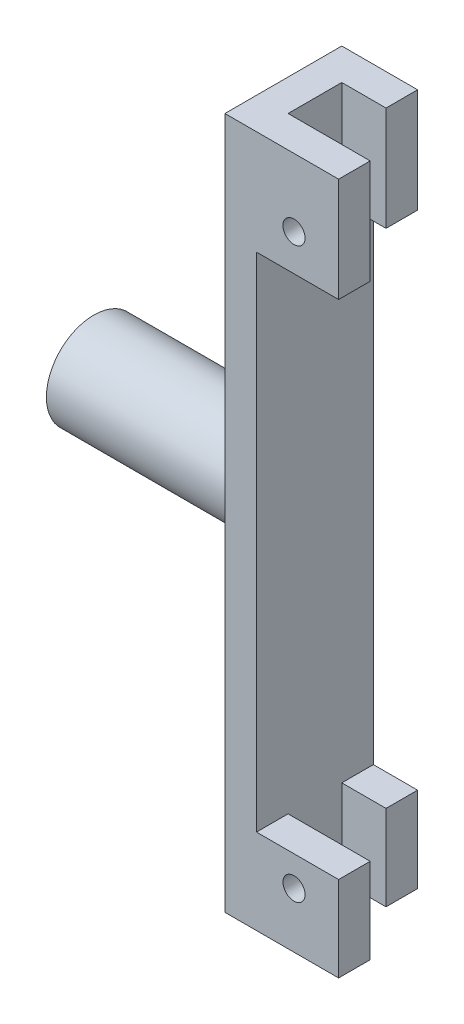
ISO-10303-21;
HEADER;
FILE_DESCRIPTION(('STEP AP214'),'2;1');
FILE_NAME('part.step','',(''),(''),'','','');
FILE_SCHEMA(('AUTOMOTIVE_DESIGN { 1 0 10303 214 1 1 1 1 }'));
ENDSEC;
DATA;
#1=APPLICATION_CONTEXT('core data for automotive mechanical design processes');
#2=APPLICATION_PROTOCOL_DEFINITION('international standard','automotive_design',2000,#1);
#3=PRODUCT_CONTEXT('',#1,'mechanical');
#4=PRODUCT('Part','Part','',(#3));
#5=PRODUCT_RELATED_PRODUCT_CATEGORY('part','',(#4));
#6=PRODUCT_DEFINITION_FORMATION('','',#4);
#7=PRODUCT_DEFINITION_CONTEXT('part definition',#1,'design');
#8=PRODUCT_DEFINITION('design','',#6,#7);
#9=PRODUCT_DEFINITION_SHAPE('','',#8);
#10=(LENGTH_UNIT() NAMED_UNIT(*) SI_UNIT(.MILLI.,.METRE.));
#11=(NAMED_UNIT(*) PLANE_ANGLE_UNIT() SI_UNIT($,.RADIAN.));
#12=(NAMED_UNIT(*) SI_UNIT($,.STERADIAN.) SOLID_ANGLE_UNIT());
#13=UNCERTAINTY_MEASURE_WITH_UNIT(LENGTH_MEASURE(1.E-05),#10,'distance_accuracy_value','');
#14=(GEOMETRIC_REPRESENTATION_CONTEXT(3) GLOBAL_UNCERTAINTY_ASSIGNED_CONTEXT((#13)) GLOBAL_UNIT_ASSIGNED_CONTEXT((#10,
#11,#12)) REPRESENTATION_CONTEXT('',''));
#15=CARTESIAN_POINT('',(0.,0.,0.));
#16=DIRECTION('',(0.,0.,1.));
#17=DIRECTION('',(1.,0.,0.));
#18=AXIS2_PLACEMENT_3D('',#15,#16,#17);
#19=CARTESIAN_POINT('',(-18.,-109.5,37.));
#20=DIRECTION('',(1.,0.,0.));
#21=DIRECTION('',(0.,0.,-1.));
#22=AXIS2_PLACEMENT_3D('',#19,#20,#21);
#23=PLANE('',#22);
#24=DIRECTION('',(0.,-1.,0.));
#25=VECTOR('',#24,1.);
#26=CARTESIAN_POINT('',(-18.,-109.5,0.));
#27=LINE('',#26,#25);
#28=CARTESIAN_POINT('',(-18.,109.5,0.));
#29=VERTEX_POINT('',#28);
#30=CARTESIAN_POINT('',(-18.,-109.5,0.));
#31=VERTEX_POINT('',#30);
#32=EDGE_CURVE('E170',#29,#31,#27,.T.);
#33=ORIENTED_EDGE('',*,*,#32,.T.);
#34=DIRECTION('',(0.,0.,-1.));
#35=VECTOR('',#34,1.);
#36=CARTESIAN_POINT('',(-18.,-109.5,37.));
#37=LINE('',#36,#35);
#38=CARTESIAN_POINT('',(-18.,-109.5,37.));
#39=VERTEX_POINT('',#38);
#40=EDGE_CURVE('E167',#39,#31,#37,.T.);
#41=ORIENTED_EDGE('',*,*,#40,.F.);
#42=DIRECTION('',(0.,-1.,0.));
#43=VECTOR('',#42,1.);
#44=CARTESIAN_POINT('',(-18.,-109.5,37.));
#45=LINE('',#44,#43);
#46=CARTESIAN_POINT('',(-18.,109.5,37.));
#47=VERTEX_POINT('',#46);
#48=EDGE_CURVE('E172',#47,#39,#45,.T.);
#49=ORIENTED_EDGE('',*,*,#48,.F.);
#50=DIRECTION('',(0.,0.,-1.));
#51=VECTOR('',#50,1.);
#52=CARTESIAN_POINT('',(-18.,109.5,37.));
#53=LINE('',#52,#51);
#54=EDGE_CURVE('E178',#47,#29,#53,.T.);
#55=ORIENTED_EDGE('',*,*,#54,.T.);
#56=EDGE_LOOP('',(#33,#41,#49,#55));
#57=FACE_BOUND('',#56,.T.);
#58=CARTESIAN_POINT('',(-18.,0.,18.5));
#59=DIRECTION('',(1.,0.,0.));
#60=DIRECTION('',(0.,0.,-1.));
#61=AXIS2_PLACEMENT_3D('',#58,#59,#60);
#62=CIRCLE('',#61,15.);
#63=CARTESIAN_POINT('',(-18.,0.,3.49999999999996));
#64=VERTEX_POINT('',#63);
#65=EDGE_CURVE('E11',#64,#64,#62,.F.);
#66=ORIENTED_EDGE('',*,*,#65,.F.);
#67=EDGE_LOOP('',(#66));
#68=FACE_BOUND('',#67,.T.);
#69=ADVANCED_FACE('F34',(#57,#68),#23,.F.);
#70=CARTESIAN_POINT('',(-7.99999999999997,-82.5,37.));
#71=DIRECTION('',(0.,1.,0.));
#72=DIRECTION('',(0.,0.,1.));
#73=AXIS2_PLACEMENT_3D('',#70,#71,#72);
#74=PLANE('',#73);
#75=DIRECTION('',(1.,0.,0.));
#76=VECTOR('',#75,1.);
#77=CARTESIAN_POINT('',(-7.99999999999997,-82.5,10.));
#78=LINE('',#77,#76);
#79=CARTESIAN_POINT('',(-7.99999999999997,-82.5,10.));
#80=VERTEX_POINT('',#79);
#81=CARTESIAN_POINT('',(6.00000000000003,-82.5,10.));
#82=VERTEX_POINT('',#81);
#83=EDGE_CURVE('E249',#80,#82,#78,.T.);
#84=ORIENTED_EDGE('',*,*,#83,.T.);
#85=DIRECTION('',(0.,0.,-1.));
#86=VECTOR('',#85,1.);
#87=CARTESIAN_POINT('',(6.00000000000003,-82.5,37.));
#88=LINE('',#87,#86);
#89=CARTESIAN_POINT('',(6.00000000000003,-82.5,0.));
#90=VERTEX_POINT('',#89);
#91=EDGE_CURVE('E56',#82,#90,#88,.T.);
#92=ORIENTED_EDGE('',*,*,#91,.T.);
#93=DIRECTION('',(1.,0.,0.));
#94=VECTOR('',#93,1.);
#95=CARTESIAN_POINT('',(-7.99999999999997,-82.5,0.));
#96=LINE('',#95,#94);
#97=CARTESIAN_POINT('',(-7.99999999999997,-82.5,0.));
#98=VERTEX_POINT('',#97);
#99=EDGE_CURVE('E162',#98,#90,#96,.T.);
#100=ORIENTED_EDGE('',*,*,#99,.F.);
#101=DIRECTION('',(0.,0.,-1.));
#102=VECTOR('',#101,1.);
#103=CARTESIAN_POINT('',(-7.99999999999997,-82.5,37.));
#104=LINE('',#103,#102);
#105=EDGE_CURVE('E269',#80,#98,#104,.T.);
#106=ORIENTED_EDGE('',*,*,#105,.F.);
#107=EDGE_LOOP('',(#84,#92,#100,#106));
#108=FACE_BOUND('',#107,.T.);
#109=ADVANCED_FACE('F310',(#108),#74,.T.);
#110=CARTESIAN_POINT('',(-7.99999999999999,76.5,37.));
#111=DIRECTION('',(0.,-1.,0.));
#112=DIRECTION('',(0.,0.,-1.));
#113=AXIS2_PLACEMENT_3D('',#110,#111,#112);
#114=PLANE('',#113);
#115=DIRECTION('',(1.,0.,0.));
#116=VECTOR('',#115,1.);
#117=CARTESIAN_POINT('',(0.,76.5,0.));
#118=LINE('',#117,#116);
#119=CARTESIAN_POINT('',(-7.99999999999999,76.5,0.));
#120=VERTEX_POINT('',#119);
#121=CARTESIAN_POINT('',(6.00000000000001,76.5,0.));
#122=VERTEX_POINT('',#121);
#123=EDGE_CURVE('E189',#120,#122,#118,.T.);
#124=ORIENTED_EDGE('',*,*,#123,.T.);
#125=DIRECTION('',(0.,0.,1.));
#126=VECTOR('',#125,1.);
#127=CARTESIAN_POINT('',(6.00000000000001,76.5,37.));
#128=LINE('',#127,#126);
#129=CARTESIAN_POINT('',(6.00000000000001,76.5,10.));
#130=VERTEX_POINT('',#129);
#131=EDGE_CURVE('E216',#122,#130,#128,.T.);
#132=ORIENTED_EDGE('',*,*,#131,.T.);
#133=DIRECTION('',(-1.,0.,0.));
#134=VECTOR('',#133,1.);
#135=CARTESIAN_POINT('',(-7.99999999999999,76.5,10.));
#136=LINE('',#135,#134);
#137=CARTESIAN_POINT('',(-7.99999999999999,76.5,10.));
#138=VERTEX_POINT('',#137);
#139=EDGE_CURVE('E247',#130,#138,#136,.T.);
#140=ORIENTED_EDGE('',*,*,#139,.T.);
#141=DIRECTION('',(0.,0.,-1.));
#142=VECTOR('',#141,1.);
#143=CARTESIAN_POINT('',(-7.99999999999999,76.5,37.));
#144=LINE('',#143,#142);
#145=EDGE_CURVE('E263',#138,#120,#144,.T.);
#146=ORIENTED_EDGE('',*,*,#145,.T.);
#147=EDGE_LOOP('',(#124,#132,#140,#146));
#148=FACE_BOUND('',#147,.T.);
#149=ADVANCED_FACE('F300',(#148),#114,.T.);
#150=CARTESIAN_POINT('',(0.,0.,0.));
#151=DIRECTION('',(0.,0.,1.));
#152=DIRECTION('',(1.,0.,0.));
#153=AXIS2_PLACEMENT_3D('',#150,#151,#152);
#154=PLANE('',#153);
#155=DIRECTION('',(0.,-1.,0.));
#156=VECTOR('',#155,1.);
#157=CARTESIAN_POINT('',(6.,126.5,0.));
#158=LINE('',#157,#156);
#159=CARTESIAN_POINT('',(6.00000000000003,-109.5,0.));
#160=VERTEX_POINT('',#159);
#161=EDGE_CURVE('E147',#90,#160,#158,.T.);
#162=ORIENTED_EDGE('',*,*,#161,.T.);
#163=DIRECTION('',(1.,0.,0.));
#164=VECTOR('',#163,1.);
#165=CARTESIAN_POINT('',(18.,-109.5,0.));
#166=LINE('',#165,#164);
#167=EDGE_CURVE('E158',#31,#160,#166,.T.);
#168=ORIENTED_EDGE('',*,*,#167,.F.);
#169=ORIENTED_EDGE('',*,*,#32,.F.);
#170=DIRECTION('',(-1.,0.,0.));
#171=VECTOR('',#170,1.);
#172=CARTESIAN_POINT('',(18.,109.5,0.));
#173=LINE('',#172,#171);
#174=CARTESIAN_POINT('',(6.,109.5,0.));
#175=VERTEX_POINT('',#174);
#176=EDGE_CURVE('E169',#175,#29,#173,.T.);
#177=ORIENTED_EDGE('',*,*,#176,.F.);
#178=EDGE_CURVE('E152',#175,#122,#158,.T.);
#179=ORIENTED_EDGE('',*,*,#178,.T.);
#180=ORIENTED_EDGE('',*,*,#123,.F.);
#181=DIRECTION('',(0.,-1.,0.));
#182=VECTOR('',#181,1.);
#183=CARTESIAN_POINT('',(-7.99999999999999,76.5,0.));
#184=LINE('',#183,#182);
#185=EDGE_CURVE('E256',#120,#98,#184,.T.);
#186=ORIENTED_EDGE('',*,*,#185,.T.);
#187=ORIENTED_EDGE('',*,*,#99,.T.);
#188=EDGE_LOOP('',(#162,#168,#169,#177,#179,#180,#186,#187));
#189=FACE_BOUND('',#188,.T.);
#190=ADVANCED_FACE('F156',(#189),#154,.F.);
#191=CARTESIAN_POINT('',(18.,-109.5,37.));
#192=DIRECTION('',(0.,1.,0.));
#193=DIRECTION('',(0.,0.,1.));
#194=AXIS2_PLACEMENT_3D('',#191,#192,#193);
#195=PLANE('',#194);
#196=DIRECTION('',(0.,0.,-1.));
#197=VECTOR('',#196,1.);
#198=CARTESIAN_POINT('',(6.00000000000003,-109.5,17.));
#199=LINE('',#198,#197);
#200=CARTESIAN_POINT('',(6.00000000000003,-109.5,10.));
#201=VERTEX_POINT('',#200);
#202=EDGE_CURVE('E144',#201,#160,#199,.T.);
#203=ORIENTED_EDGE('',*,*,#202,.F.);
#204=DIRECTION('',(1.,0.,0.));
#205=VECTOR('',#204,1.);
#206=CARTESIAN_POINT('',(-7.99999999999997,-109.5,10.));
#207=LINE('',#206,#205);
#208=CARTESIAN_POINT('',(-7.99999999999997,-109.5,10.));
#209=VERTEX_POINT('',#208);
#210=EDGE_CURVE('E238',#209,#201,#207,.T.);
#211=ORIENTED_EDGE('',*,*,#210,.F.);
#212=DIRECTION('',(0.,0.,-1.));
#213=VECTOR('',#212,1.);
#214=CARTESIAN_POINT('',(-7.99999999999997,-109.5,27.));
#215=LINE('',#214,#213);
#216=CARTESIAN_POINT('',(-7.99999999999997,-109.5,27.));
#217=VERTEX_POINT('',#216);
#218=EDGE_CURVE('E244',#217,#209,#215,.T.);
#219=ORIENTED_EDGE('',*,*,#218,.F.);
#220=DIRECTION('',(1.,0.,0.));
#221=VECTOR('',#220,1.);
#222=CARTESIAN_POINT('',(-7.99999999999997,-109.5,27.));
#223=LINE('',#222,#221);
#224=CARTESIAN_POINT('',(18.,-109.5,27.));
#225=VERTEX_POINT('',#224);
#226=EDGE_CURVE('E223',#217,#225,#223,.T.);
#227=ORIENTED_EDGE('',*,*,#226,.T.);
#228=DIRECTION('',(0.,0.,-1.));
#229=VECTOR('',#228,1.);
#230=CARTESIAN_POINT('',(18.,-109.5,37.));
#231=LINE('',#230,#229);
#232=CARTESIAN_POINT('',(18.,-109.5,37.));
#233=VERTEX_POINT('',#232);
#234=EDGE_CURVE('E185',#233,#225,#231,.T.);
#235=ORIENTED_EDGE('',*,*,#234,.F.);
#236=DIRECTION('',(1.,0.,0.));
#237=VECTOR('',#236,1.);
#238=CARTESIAN_POINT('',(18.,-109.5,37.));
#239=LINE('',#238,#237);
#240=EDGE_CURVE('E279',#39,#233,#239,.T.);
#241=ORIENTED_EDGE('',*,*,#240,.F.);
#242=ORIENTED_EDGE('',*,*,#40,.T.);
#243=ORIENTED_EDGE('',*,*,#167,.T.);
#244=EDGE_LOOP('',(#203,#211,#219,#227,#235,#241,#242,#243));
#245=FACE_BOUND('',#244,.T.);
#246=ADVANCED_FACE('F165',(#245),#195,.F.);
#247=CARTESIAN_POINT('',(18.,109.5,37.));
#248=DIRECTION('',(0.,-1.,0.));
#249=DIRECTION('',(0.,0.,-1.));
#250=AXIS2_PLACEMENT_3D('',#247,#248,#249);
#251=PLANE('',#250);
#252=DIRECTION('',(0.,0.,1.));
#253=VECTOR('',#252,1.);
#254=CARTESIAN_POINT('',(6.,109.5,37.));
#255=LINE('',#254,#253);
#256=CARTESIAN_POINT('',(6.,109.5,10.));
#257=VERTEX_POINT('',#256);
#258=EDGE_CURVE('E48',#175,#257,#255,.T.);
#259=ORIENTED_EDGE('',*,*,#258,.F.);
#260=ORIENTED_EDGE('',*,*,#176,.T.);
#261=ORIENTED_EDGE('',*,*,#54,.F.);
#262=DIRECTION('',(-1.,0.,0.));
#263=VECTOR('',#262,1.);
#264=CARTESIAN_POINT('',(18.,109.5,37.));
#265=LINE('',#264,#263);
#266=CARTESIAN_POINT('',(18.,109.5,37.));
#267=VERTEX_POINT('',#266);
#268=EDGE_CURVE('E182',#267,#47,#265,.T.);
#269=ORIENTED_EDGE('',*,*,#268,.F.);
#270=DIRECTION('',(0.,0.,-1.));
#271=VECTOR('',#270,1.);
#272=CARTESIAN_POINT('',(18.,109.5,37.));
#273=LINE('',#272,#271);
#274=CARTESIAN_POINT('',(18.,109.5,27.));
#275=VERTEX_POINT('',#274);
#276=EDGE_CURVE('E181',#267,#275,#273,.T.);
#277=ORIENTED_EDGE('',*,*,#276,.T.);
#278=DIRECTION('',(-1.,0.,0.));
#279=VECTOR('',#278,1.);
#280=CARTESIAN_POINT('',(-8.,109.5,27.));
#281=LINE('',#280,#279);
#282=CARTESIAN_POINT('',(-8.,109.5,27.));
#283=VERTEX_POINT('',#282);
#284=EDGE_CURVE('E231',#275,#283,#281,.T.);
#285=ORIENTED_EDGE('',*,*,#284,.T.);
#286=DIRECTION('',(0.,0.,-1.));
#287=VECTOR('',#286,1.);
#288=CARTESIAN_POINT('',(-8.,109.5,27.));
#289=LINE('',#288,#287);
#290=CARTESIAN_POINT('',(-8.,109.5,10.));
#291=VERTEX_POINT('',#290);
#292=EDGE_CURVE('E234',#283,#291,#289,.T.);
#293=ORIENTED_EDGE('',*,*,#292,.T.);
#294=DIRECTION('',(-1.,0.,0.));
#295=VECTOR('',#294,1.);
#296=CARTESIAN_POINT('',(-8.,109.5,10.));
#297=LINE('',#296,#295);
#298=EDGE_CURVE('E240',#257,#291,#297,.T.);
#299=ORIENTED_EDGE('',*,*,#298,.F.);
#300=EDGE_LOOP('',(#259,#260,#261,#269,#277,#285,#293,#299));
#301=FACE_BOUND('',#300,.T.);
#302=ADVANCED_FACE('F293',(#301),#251,.F.);
#303=CARTESIAN_POINT('',(0.,0.,10.));
#304=DIRECTION('',(0.,0.,1.));
#305=DIRECTION('',(1.,0.,0.));
#306=AXIS2_PLACEMENT_3D('',#303,#304,#305);
#307=PLANE('',#306);
#308=ORIENTED_EDGE('',*,*,#139,.F.);
#309=DIRECTION('',(0.,1.,0.));
#310=VECTOR('',#309,1.);
#311=CARTESIAN_POINT('',(6.00000000000002,0.,10.));
#312=LINE('',#311,#310);
#313=EDGE_CURVE('E213',#130,#257,#312,.T.);
#314=ORIENTED_EDGE('',*,*,#313,.T.);
#315=ORIENTED_EDGE('',*,*,#298,.T.);
#316=DIRECTION('',(0.,-1.,0.));
#317=VECTOR('',#316,1.);
#318=CARTESIAN_POINT('',(-8.,109.5,10.));
#319=LINE('',#318,#317);
#320=EDGE_CURVE('E235',#291,#138,#319,.T.);
#321=ORIENTED_EDGE('',*,*,#320,.T.);
#322=EDGE_LOOP('',(#308,#314,#315,#321));
#323=FACE_BOUND('',#322,.T.);
#324=ADVANCED_FACE('F375',(#323),#307,.T.);
#325=ORIENTED_EDGE('',*,*,#210,.T.);
#326=DIRECTION('',(0.,1.,0.));
#327=VECTOR('',#326,1.);
#328=CARTESIAN_POINT('',(6.00000000000002,0.,10.));
#329=LINE('',#328,#327);
#330=EDGE_CURVE('E41',#201,#82,#329,.T.);
#331=ORIENTED_EDGE('',*,*,#330,.T.);
#332=ORIENTED_EDGE('',*,*,#83,.F.);
#333=EDGE_CURVE('E219',#80,#209,#319,.T.);
#334=ORIENTED_EDGE('',*,*,#333,.T.);
#335=EDGE_LOOP('',(#325,#331,#332,#334));
#336=FACE_BOUND('',#335,.T.);
#337=ADVANCED_FACE('F312',(#336),#307,.T.);
#338=CARTESIAN_POINT('',(18.,-109.5,37.));
#339=DIRECTION('',(-1.,0.,0.));
#340=DIRECTION('',(0.,0.,1.));
#341=AXIS2_PLACEMENT_3D('',#338,#339,#340);
#342=PLANE('',#341);
#343=ORIENTED_EDGE('',*,*,#234,.T.);
#344=DIRECTION('',(0.,1.,0.));
#345=VECTOR('',#344,1.);
#346=CARTESIAN_POINT('',(18.,109.5,27.));
#347=LINE('',#346,#345);
#348=CARTESIAN_POINT('',(18.,-82.5,27.));
#349=VERTEX_POINT('',#348);
#350=EDGE_CURVE('E228',#225,#349,#347,.T.);
#351=ORIENTED_EDGE('',*,*,#350,.T.);
#352=DIRECTION('',(0.,0.,-1.));
#353=VECTOR('',#352,1.);
#354=CARTESIAN_POINT('',(18.,-82.5,37.));
#355=LINE('',#354,#353);
#356=CARTESIAN_POINT('',(18.,-82.5,37.));
#357=VERTEX_POINT('',#356);
#358=EDGE_CURVE('E174',#357,#349,#355,.T.);
#359=ORIENTED_EDGE('',*,*,#358,.F.);
#360=DIRECTION('',(0.,1.,0.));
#361=VECTOR('',#360,1.);
#362=CARTESIAN_POINT('',(18.,-109.5,37.));
#363=LINE('',#362,#361);
#364=EDGE_CURVE('E282',#233,#357,#363,.T.);
#365=ORIENTED_EDGE('',*,*,#364,.F.);
#366=EDGE_LOOP('',(#343,#351,#359,#365));
#367=FACE_BOUND('',#366,.T.);
#368=ADVANCED_FACE('F322',(#367),#342,.F.);
#369=DIRECTION('',(0.,0.,1.));
#370=VECTOR('',#369,1.);
#371=CARTESIAN_POINT('',(18.,76.5,37.));
#372=LINE('',#371,#370);
#373=CARTESIAN_POINT('',(18.,76.5,27.));
#374=VERTEX_POINT('',#373);
#375=CARTESIAN_POINT('',(18.,76.5,37.));
#376=VERTEX_POINT('',#375);
#377=EDGE_CURVE('E273',#374,#376,#372,.T.);
#378=ORIENTED_EDGE('',*,*,#377,.F.);
#379=EDGE_CURVE('E227',#374,#275,#347,.T.);
#380=ORIENTED_EDGE('',*,*,#379,.T.);
#381=ORIENTED_EDGE('',*,*,#276,.F.);
#382=EDGE_CURVE('E281',#376,#267,#363,.T.);
#383=ORIENTED_EDGE('',*,*,#382,.F.);
#384=EDGE_LOOP('',(#378,#380,#381,#383));
#385=FACE_BOUND('',#384,.T.);
#386=ADVANCED_FACE('F336',(#385),#342,.F.);
#387=CARTESIAN_POINT('',(0.,0.,37.));
#388=DIRECTION('',(0.,0.,1.));
#389=DIRECTION('',(1.,0.,0.));
#390=AXIS2_PLACEMENT_3D('',#387,#388,#389);
#391=PLANE('',#390);
#392=CARTESIAN_POINT('',(3.87816962595056,-92.,37.));
#393=DIRECTION('',(0.,0.,1.));
#394=DIRECTION('',(1.,0.,0.));
#395=AXIS2_PLACEMENT_3D('',#392,#393,#394);
#396=CIRCLE('',#395,3.5);
#397=CARTESIAN_POINT('',(7.37816962595056,-92.,37.));
#398=VERTEX_POINT('',#397);
#399=EDGE_CURVE('E197',#398,#398,#396,.T.);
#400=ORIENTED_EDGE('',*,*,#399,.F.);
#401=EDGE_LOOP('',(#400));
#402=FACE_BOUND('',#401,.T.);
#403=CARTESIAN_POINT('',(3.87816962595056,88.,37.));
#404=DIRECTION('',(0.,0.,1.));
#405=DIRECTION('',(1.,0.,0.));
#406=AXIS2_PLACEMENT_3D('',#403,#404,#405);
#407=CIRCLE('',#406,3.5);
#408=CARTESIAN_POINT('',(7.37816962595056,88.,37.));
#409=VERTEX_POINT('',#408);
#410=EDGE_CURVE('E194',#409,#409,#407,.T.);
#411=ORIENTED_EDGE('',*,*,#410,.F.);
#412=EDGE_LOOP('',(#411));
#413=FACE_BOUND('',#412,.T.);
#414=ORIENTED_EDGE('',*,*,#364,.T.);
#415=DIRECTION('',(1.,0.,0.));
#416=VECTOR('',#415,1.);
#417=CARTESIAN_POINT('',(-7.99999999999997,-82.5,37.));
#418=LINE('',#417,#416);
#419=CARTESIAN_POINT('',(-7.99999999999997,-82.5,37.));
#420=VERTEX_POINT('',#419);
#421=EDGE_CURVE('E259',#420,#357,#418,.T.);
#422=ORIENTED_EDGE('',*,*,#421,.F.);
#423=DIRECTION('',(0.,-1.,0.));
#424=VECTOR('',#423,1.);
#425=CARTESIAN_POINT('',(-7.99999999999999,76.5,37.));
#426=LINE('',#425,#424);
#427=CARTESIAN_POINT('',(-7.99999999999999,76.5,37.));
#428=VERTEX_POINT('',#427);
#429=EDGE_CURVE('E257',#428,#420,#426,.T.);
#430=ORIENTED_EDGE('',*,*,#429,.F.);
#431=DIRECTION('',(-1.,0.,0.));
#432=VECTOR('',#431,1.);
#433=CARTESIAN_POINT('',(-7.99999999999999,76.5,37.));
#434=LINE('',#433,#432);
#435=EDGE_CURVE('E261',#376,#428,#434,.T.);
#436=ORIENTED_EDGE('',*,*,#435,.F.);
#437=ORIENTED_EDGE('',*,*,#382,.T.);
#438=ORIENTED_EDGE('',*,*,#268,.T.);
#439=ORIENTED_EDGE('',*,*,#48,.T.);
#440=ORIENTED_EDGE('',*,*,#240,.T.);
#441=EDGE_LOOP('',(#414,#422,#430,#436,#437,#438,#439,#440));
#442=FACE_BOUND('',#441,.T.);
#443=ADVANCED_FACE('F287',(#402,#413,#442),#391,.T.);
#444=DIRECTION('',(1.,0.,0.));
#445=VECTOR('',#444,1.);
#446=CARTESIAN_POINT('',(-7.99999999999997,-82.5,27.));
#447=LINE('',#446,#445);
#448=CARTESIAN_POINT('',(-7.99999999999997,-82.5,27.));
#449=VERTEX_POINT('',#448);
#450=EDGE_CURVE('E254',#449,#349,#447,.T.);
#451=ORIENTED_EDGE('',*,*,#450,.F.);
#452=EDGE_CURVE('E270',#420,#449,#104,.T.);
#453=ORIENTED_EDGE('',*,*,#452,.F.);
#454=ORIENTED_EDGE('',*,*,#421,.T.);
#455=ORIENTED_EDGE('',*,*,#358,.T.);
#456=EDGE_LOOP('',(#451,#453,#454,#455));
#457=FACE_BOUND('',#456,.T.);
#458=ADVANCED_FACE('F325',(#457),#74,.T.);
#459=DIRECTION('',(-1.,0.,0.));
#460=VECTOR('',#459,1.);
#461=CARTESIAN_POINT('',(-7.99999999999999,76.5,27.));
#462=LINE('',#461,#460);
#463=CARTESIAN_POINT('',(-7.99999999999999,76.5,27.));
#464=VERTEX_POINT('',#463);
#465=EDGE_CURVE('E252',#374,#464,#462,.T.);
#466=ORIENTED_EDGE('',*,*,#465,.F.);
#467=ORIENTED_EDGE('',*,*,#377,.T.);
#468=ORIENTED_EDGE('',*,*,#435,.T.);
#469=EDGE_CURVE('E266',#428,#464,#144,.T.);
#470=ORIENTED_EDGE('',*,*,#469,.T.);
#471=EDGE_LOOP('',(#466,#467,#468,#470));
#472=FACE_BOUND('',#471,.T.);
#473=ADVANCED_FACE('F332',(#472),#114,.T.);
#474=CARTESIAN_POINT('',(-7.99999999999999,76.5,37.));
#475=DIRECTION('',(1.,0.,0.));
#476=DIRECTION('',(0.,1.,0.));
#477=AXIS2_PLACEMENT_3D('',#474,#475,#476);
#478=PLANE('',#477);
#479=ORIENTED_EDGE('',*,*,#452,.T.);
#480=DIRECTION('',(0.,-1.,0.));
#481=VECTOR('',#480,1.);
#482=CARTESIAN_POINT('',(-8.,109.5,27.));
#483=LINE('',#482,#481);
#484=EDGE_CURVE('E224',#449,#217,#483,.T.);
#485=ORIENTED_EDGE('',*,*,#484,.T.);
#486=ORIENTED_EDGE('',*,*,#218,.T.);
#487=ORIENTED_EDGE('',*,*,#333,.F.);
#488=ORIENTED_EDGE('',*,*,#105,.T.);
#489=ORIENTED_EDGE('',*,*,#185,.F.);
#490=ORIENTED_EDGE('',*,*,#145,.F.);
#491=ORIENTED_EDGE('',*,*,#320,.F.);
#492=ORIENTED_EDGE('',*,*,#292,.F.);
#493=EDGE_CURVE('E220',#283,#464,#483,.T.);
#494=ORIENTED_EDGE('',*,*,#493,.T.);
#495=ORIENTED_EDGE('',*,*,#469,.F.);
#496=ORIENTED_EDGE('',*,*,#429,.T.);
#497=EDGE_LOOP('',(#479,#485,#486,#487,#488,#489,#490,#491,#492,#494,#495,#496));
#498=FACE_BOUND('',#497,.T.);
#499=ADVANCED_FACE('F306',(#498),#478,.T.);
#500=CARTESIAN_POINT('',(0.,0.,27.));
#501=DIRECTION('',(0.,0.,1.));
#502=DIRECTION('',(1.,0.,0.));
#503=AXIS2_PLACEMENT_3D('',#500,#501,#502);
#504=PLANE('',#503);
#505=CARTESIAN_POINT('',(3.87816962595056,88.,27.));
#506=DIRECTION('',(0.,0.,1.));
#507=DIRECTION('',(1.,0.,0.));
#508=AXIS2_PLACEMENT_3D('',#505,#506,#507);
#509=CIRCLE('',#508,3.5);
#510=CARTESIAN_POINT('',(7.37816962595056,88.,27.));
#511=VERTEX_POINT('',#510);
#512=EDGE_CURVE('E163',#511,#511,#509,.T.);
#513=ORIENTED_EDGE('',*,*,#512,.T.);
#514=EDGE_LOOP('',(#513));
#515=FACE_BOUND('',#514,.T.);
#516=ORIENTED_EDGE('',*,*,#465,.T.);
#517=ORIENTED_EDGE('',*,*,#493,.F.);
#518=ORIENTED_EDGE('',*,*,#284,.F.);
#519=ORIENTED_EDGE('',*,*,#379,.F.);
#520=EDGE_LOOP('',(#516,#517,#518,#519));
#521=FACE_BOUND('',#520,.T.);
#522=ADVANCED_FACE('F339',(#515,#521),#504,.F.);
#523=CARTESIAN_POINT('',(3.87816962595056,-92.,27.));
#524=DIRECTION('',(0.,0.,1.));
#525=DIRECTION('',(1.,0.,0.));
#526=AXIS2_PLACEMENT_3D('',#523,#524,#525);
#527=CIRCLE('',#526,3.5);
#528=CARTESIAN_POINT('',(7.37816962595056,-92.,27.));
#529=VERTEX_POINT('',#528);
#530=EDGE_CURVE('E195',#529,#529,#527,.T.);
#531=ORIENTED_EDGE('',*,*,#530,.T.);
#532=EDGE_LOOP('',(#531));
#533=FACE_BOUND('',#532,.T.);
#534=ORIENTED_EDGE('',*,*,#450,.T.);
#535=ORIENTED_EDGE('',*,*,#350,.F.);
#536=ORIENTED_EDGE('',*,*,#226,.F.);
#537=ORIENTED_EDGE('',*,*,#484,.F.);
#538=EDGE_LOOP('',(#534,#535,#536,#537));
#539=FACE_BOUND('',#538,.T.);
#540=ADVANCED_FACE('F319',(#533,#539),#504,.F.);
#541=CARTESIAN_POINT('',(6.,126.5,17.));
#542=DIRECTION('',(1.,0.,0.));
#543=DIRECTION('',(0.,1.,0.));
#544=AXIS2_PLACEMENT_3D('',#541,#542,#543);
#545=PLANE('',#544);
#546=ORIENTED_EDGE('',*,*,#330,.F.);
#547=ORIENTED_EDGE('',*,*,#202,.T.);
#548=ORIENTED_EDGE('',*,*,#161,.F.);
#549=ORIENTED_EDGE('',*,*,#91,.F.);
#550=EDGE_LOOP('',(#546,#547,#548,#549));
#551=FACE_BOUND('',#550,.T.);
#552=ADVANCED_FACE('F146',(#551),#545,.T.);
#553=ORIENTED_EDGE('',*,*,#178,.F.);
#554=ORIENTED_EDGE('',*,*,#258,.T.);
#555=ORIENTED_EDGE('',*,*,#313,.F.);
#556=ORIENTED_EDGE('',*,*,#131,.F.);
#557=EDGE_LOOP('',(#553,#554,#555,#556));
#558=FACE_BOUND('',#557,.T.);
#559=ADVANCED_FACE('F465',(#558),#545,.T.);
#560=CARTESIAN_POINT('',(3.87816962595056,88.,20.));
#561=DIRECTION('',(0.,0.,1.));
#562=DIRECTION('',(1.,0.,0.));
#563=AXIS2_PLACEMENT_3D('',#560,#561,#562);
#564=CYLINDRICAL_SURFACE('',#563,3.5);
#565=ORIENTED_EDGE('',*,*,#410,.T.);
#566=EDGE_LOOP('',(#565));
#567=FACE_BOUND('',#566,.T.);
#568=ORIENTED_EDGE('',*,*,#512,.F.);
#569=EDGE_LOOP('',(#568));
#570=FACE_BOUND('',#569,.T.);
#571=ADVANCED_FACE('F469',(#567,#570),#564,.F.);
#572=CARTESIAN_POINT('',(3.87816962595056,-92.,20.));
#573=DIRECTION('',(0.,0.,1.));
#574=DIRECTION('',(1.,0.,0.));
#575=AXIS2_PLACEMENT_3D('',#572,#573,#574);
#576=CYLINDRICAL_SURFACE('',#575,3.5);
#577=ORIENTED_EDGE('',*,*,#399,.T.);
#578=EDGE_LOOP('',(#577));
#579=FACE_BOUND('',#578,.T.);
#580=ORIENTED_EDGE('',*,*,#530,.F.);
#581=EDGE_LOOP('',(#580));
#582=FACE_BOUND('',#581,.T.);
#583=ADVANCED_FACE('F483',(#579,#582),#576,.F.);
#584=CARTESIAN_POINT('',(-78.,0.,18.5));
#585=DIRECTION('',(1.,0.,0.));
#586=DIRECTION('',(0.,0.,-1.));
#587=AXIS2_PLACEMENT_3D('',#584,#585,#586);
#588=CYLINDRICAL_SURFACE('',#587,15.);
#589=CARTESIAN_POINT('',(-78.,0.,18.5));
#590=DIRECTION('',(-1.,0.,0.));
#591=DIRECTION('',(0.,0.,1.));
#592=AXIS2_PLACEMENT_3D('',#589,#590,#591);
#593=CIRCLE('',#592,15.);
#594=CARTESIAN_POINT('',(-78.,0.,33.5));
#595=VERTEX_POINT('',#594);
#596=EDGE_CURVE('E203',#595,#595,#593,.T.);
#597=ORIENTED_EDGE('',*,*,#596,.F.);
#598=EDGE_LOOP('',(#597));
#599=FACE_BOUND('',#598,.T.);
#600=ORIENTED_EDGE('',*,*,#65,.T.);
#601=EDGE_LOOP('',(#600));
#602=FACE_BOUND('',#601,.T.);
#603=ADVANCED_FACE('F487',(#599,#602),#588,.T.);
#604=CARTESIAN_POINT('',(-78.,0.,18.5));
#605=DIRECTION('',(-1.,0.,0.));
#606=DIRECTION('',(0.,0.,1.));
#607=AXIS2_PLACEMENT_3D('',#604,#605,#606);
#608=PLANE('',#607);
#609=CARTESIAN_POINT('',(-78.,0.,18.5));
#610=DIRECTION('',(-1.,0.,0.));
#611=DIRECTION('',(0.,0.,1.));
#612=AXIS2_PLACEMENT_3D('',#609,#610,#611);
#613=CIRCLE('',#612,11.);
#614=CARTESIAN_POINT('',(-78.,0.,29.5));
#615=VERTEX_POINT('',#614);
#616=EDGE_CURVE('E506',#615,#615,#613,.T.);
#617=ORIENTED_EDGE('',*,*,#616,.F.);
#618=EDGE_LOOP('',(#617));
#619=FACE_BOUND('',#618,.T.);
#620=ORIENTED_EDGE('',*,*,#596,.T.);
#621=EDGE_LOOP('',(#620));
#622=FACE_BOUND('',#621,.T.);
#623=ADVANCED_FACE('F490',(#619,#622),#608,.T.);
#624=CARTESIAN_POINT('',(-75.,0.,18.5));
#625=DIRECTION('',(-1.,0.,0.));
#626=DIRECTION('',(0.,0.,1.));
#627=AXIS2_PLACEMENT_3D('',#624,#625,#626);
#628=CYLINDRICAL_SURFACE('',#627,11.);
#629=CARTESIAN_POINT('',(-75.,0.,18.5));
#630=DIRECTION('',(-1.,0.,0.));
#631=DIRECTION('',(0.,0.,1.));
#632=AXIS2_PLACEMENT_3D('',#629,#630,#631);
#633=CIRCLE('',#632,11.);
#634=CARTESIAN_POINT('',(-75.,0.,29.5));
#635=VERTEX_POINT('',#634);
#636=EDGE_CURVE('E208',#635,#635,#633,.T.);
#637=ORIENTED_EDGE('',*,*,#636,.F.);
#638=EDGE_LOOP('',(#637));
#639=FACE_BOUND('',#638,.T.);
#640=ORIENTED_EDGE('',*,*,#616,.T.);
#641=EDGE_LOOP('',(#640));
#642=FACE_BOUND('',#641,.T.);
#643=ADVANCED_FACE('F494',(#639,#642),#628,.F.);
#644=CARTESIAN_POINT('',(-75.,0.,18.5));
#645=DIRECTION('',(-1.,0.,0.));
#646=DIRECTION('',(0.,0.,1.));
#647=AXIS2_PLACEMENT_3D('',#644,#645,#646);
#648=PLANE('',#647);
#649=ORIENTED_EDGE('',*,*,#636,.T.);
#650=EDGE_LOOP('',(#649));
#651=FACE_BOUND('',#650,.T.);
#652=ADVANCED_FACE('F498',(#651),#648,.T.);
#653=CLOSED_SHELL('',(#69,#109,#149,#190,#246,#302,#324,#337,#368,#386,#443,#458,#473,#499,#522,
#540,#552,#559,#571,#583,#603,#623,#643,#652));
#654=MANIFOLD_SOLID_BREP('B2',#653);
#655=ADVANCED_BREP_SHAPE_REPRESENTATION('',(#18,#654),#14);
#656=SHAPE_DEFINITION_REPRESENTATION(#9,#655);
ENDSEC;
END-ISO-10303-21;
